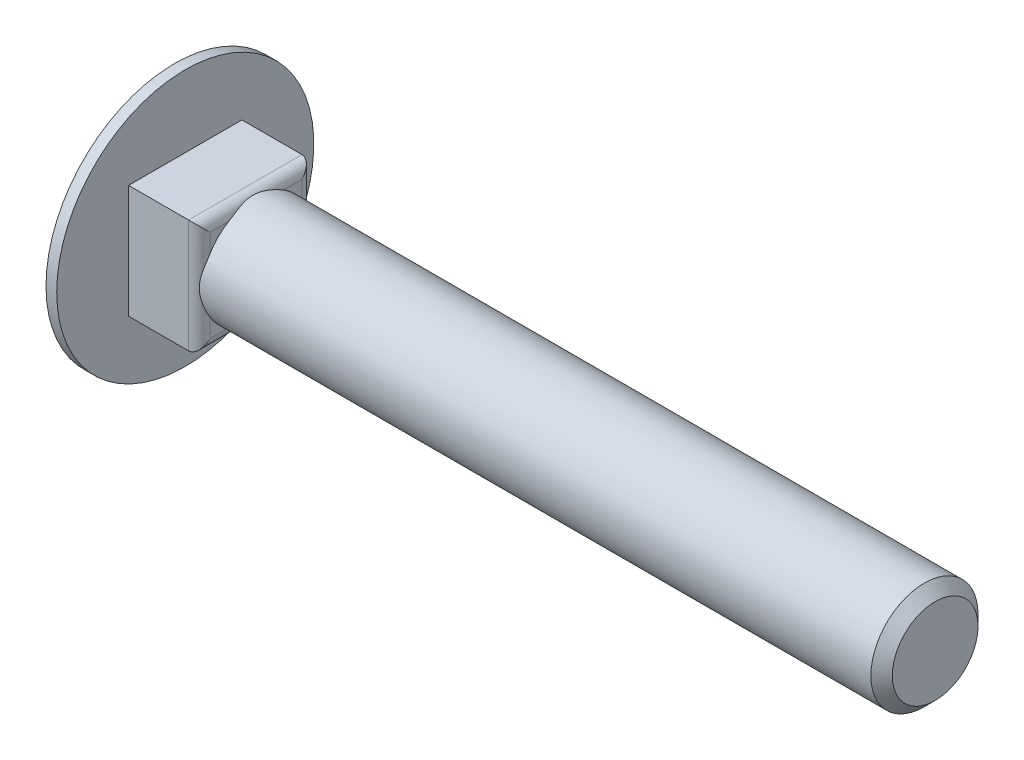
ISO-10303-21;
HEADER;
FILE_DESCRIPTION(('STEP AP214'),'2;1');
FILE_NAME('part.step','',(''),(''),'','','');
FILE_SCHEMA(('AUTOMOTIVE_DESIGN { 1 0 10303 214 1 1 1 1 }'));
ENDSEC;
DATA;
#1=APPLICATION_CONTEXT('core data for automotive mechanical design processes');
#2=APPLICATION_PROTOCOL_DEFINITION('international standard','automotive_design',2000,#1);
#3=PRODUCT_CONTEXT('',#1,'mechanical');
#4=PRODUCT('Part','Part','',(#3));
#5=PRODUCT_RELATED_PRODUCT_CATEGORY('part','',(#4));
#6=PRODUCT_DEFINITION_FORMATION('','',#4);
#7=PRODUCT_DEFINITION_CONTEXT('part definition',#1,'design');
#8=PRODUCT_DEFINITION('design','',#6,#7);
#9=PRODUCT_DEFINITION_SHAPE('','',#8);
#10=(LENGTH_UNIT() NAMED_UNIT(*) SI_UNIT(.MILLI.,.METRE.));
#11=(NAMED_UNIT(*) PLANE_ANGLE_UNIT() SI_UNIT($,.RADIAN.));
#12=(NAMED_UNIT(*) SI_UNIT($,.STERADIAN.) SOLID_ANGLE_UNIT());
#13=UNCERTAINTY_MEASURE_WITH_UNIT(LENGTH_MEASURE(1.E-05),#10,'distance_accuracy_value','');
#14=(GEOMETRIC_REPRESENTATION_CONTEXT(3) GLOBAL_UNCERTAINTY_ASSIGNED_CONTEXT((#13)) GLOBAL_UNIT_ASSIGNED_CONTEXT((#10,
#11,#12)) REPRESENTATION_CONTEXT('',''));
#15=CARTESIAN_POINT('',(0.,0.,0.));
#16=DIRECTION('',(0.,0.,1.));
#17=DIRECTION('',(1.,0.,0.));
#18=AXIS2_PLACEMENT_3D('',#15,#16,#17);
#19=CARTESIAN_POINT('',(37.5014084523517,0.,0.123465529352245));
#20=DIRECTION('',(0.,-1.,0.));
#21=DIRECTION('',(0.,0.,1.));
#22=AXIS2_PLACEMENT_3D('',#19,#20,#21);
#23=CIRCLE('',#22,40.2915688928503);
#24=TRIMMED_CURVE('',#23,(PARAMETER_VALUE(-1.57386063344684)),
(PARAMETER_VALUE(1.57386063344684)),.T.,.PARAMETER.);
#25=CARTESIAN_POINT('',(37.5014084523517,0.,0.));
#26=DIRECTION('',(-1.,0.,0.));
#27=AXIS1_PLACEMENT('',#25,#26);
#28=SURFACE_OF_REVOLUTION('',#24,#27);
#29=CARTESIAN_POINT('',(-1.,0.,0.));
#30=DIRECTION('',(-1.,0.,0.));
#31=DIRECTION('',(0.,0.,1.));
#32=AXIS2_PLACEMENT_3D('',#29,#30,#31);
#33=CIRCLE('',#32,12.);
#34=CARTESIAN_POINT('',(-1.,0.,12.));
#35=VERTEX_POINT('',#34);
#36=EDGE_CURVE('E263',#35,#35,#33,.F.);
#37=ORIENTED_EDGE('',*,*,#36,.F.);
#38=EDGE_LOOP('',(#37));
#39=FACE_BOUND('',#38,.T.);
#40=CARTESIAN_POINT('',(-2.78997127222914,0.,0.));
#41=VERTEX_POINT('',#40);
#42=VERTEX_LOOP('',#41);
#43=FACE_BOUND('',#42,.T.);
#44=ADVANCED_FACE('F16',(#39,#43),#28,.T.);
#45=CARTESIAN_POINT('',(-0.5,0.,0.));
#46=DIRECTION('',(-1.,0.,0.));
#47=DIRECTION('',(0.,0.,1.));
#48=AXIS2_PLACEMENT_3D('',#45,#46,#47);
#49=CYLINDRICAL_SURFACE('',#48,12.);
#50=CARTESIAN_POINT('',(0.,0.,0.));
#51=DIRECTION('',(-1.,0.,0.));
#52=DIRECTION('',(0.,0.,1.));
#53=AXIS2_PLACEMENT_3D('',#50,#51,#52);
#54=CIRCLE('',#53,12.);
#55=CARTESIAN_POINT('',(0.,0.,12.));
#56=VERTEX_POINT('',#55);
#57=EDGE_CURVE('E19',#56,#56,#54,.F.);
#58=ORIENTED_EDGE('',*,*,#57,.F.);
#59=EDGE_LOOP('',(#58));
#60=FACE_BOUND('',#59,.T.);
#61=ORIENTED_EDGE('',*,*,#36,.T.);
#62=EDGE_LOOP('',(#61));
#63=FACE_BOUND('',#62,.T.);
#64=ADVANCED_FACE('F273',(#60,#63),#49,.T.);
#65=CARTESIAN_POINT('',(0.,0.,12.));
#66=DIRECTION('',(1.,0.,0.));
#67=DIRECTION('',(0.,0.,-1.));
#68=AXIS2_PLACEMENT_3D('',#65,#66,#67);
#69=PLANE('',#68);
#70=DIRECTION('',(0.,-1.,0.));
#71=VECTOR('',#70,1.);
#72=CARTESIAN_POINT('',(0.,5.29,5.29));
#73=LINE('',#72,#71);
#74=CARTESIAN_POINT('',(0.,5.29,5.29));
#75=VERTEX_POINT('',#74);
#76=CARTESIAN_POINT('',(0.,-5.29,5.29));
#77=VERTEX_POINT('',#76);
#78=EDGE_CURVE('E97',#75,#77,#73,.T.);
#79=ORIENTED_EDGE('',*,*,#78,.F.);
#80=DIRECTION('',(0.,0.,1.));
#81=VECTOR('',#80,1.);
#82=CARTESIAN_POINT('',(0.,5.29,-5.29));
#83=LINE('',#82,#81);
#84=CARTESIAN_POINT('',(0.,5.29,-5.29));
#85=VERTEX_POINT('',#84);
#86=EDGE_CURVE('E92',#85,#75,#83,.T.);
#87=ORIENTED_EDGE('',*,*,#86,.F.);
#88=DIRECTION('',(0.,1.,0.));
#89=VECTOR('',#88,1.);
#90=CARTESIAN_POINT('',(0.,-5.29,-5.29));
#91=LINE('',#90,#89);
#92=CARTESIAN_POINT('',(0.,-5.29,-5.29));
#93=VERTEX_POINT('',#92);
#94=EDGE_CURVE('E237',#93,#85,#91,.T.);
#95=ORIENTED_EDGE('',*,*,#94,.F.);
#96=DIRECTION('',(0.,0.,-1.));
#97=VECTOR('',#96,1.);
#98=CARTESIAN_POINT('',(0.,-5.29,5.29));
#99=LINE('',#98,#97);
#100=EDGE_CURVE('E238',#77,#93,#99,.T.);
#101=ORIENTED_EDGE('',*,*,#100,.F.);
#102=EDGE_LOOP('',(#79,#87,#95,#101));
#103=FACE_BOUND('',#102,.T.);
#104=ORIENTED_EDGE('',*,*,#57,.T.);
#105=EDGE_LOOP('',(#104));
#106=FACE_BOUND('',#105,.T.);
#107=ADVANCED_FACE('F271',(#103,#106),#69,.T.);
#108=CARTESIAN_POINT('',(0.,5.29,-5.29));
#109=DIRECTION('',(0.,1.,0.));
#110=DIRECTION('',(0.,0.,1.));
#111=AXIS2_PLACEMENT_3D('',#108,#109,#110);
#112=PLANE('',#111);
#113=ORIENTED_EDGE('',*,*,#86,.T.);
#114=DIRECTION('',(1.,0.,0.));
#115=VECTOR('',#114,1.);
#116=CARTESIAN_POINT('',(0.,5.29,5.29));
#117=LINE('',#116,#115);
#118=CARTESIAN_POINT('',(5.6,5.29,5.29));
#119=VERTEX_POINT('',#118);
#120=EDGE_CURVE('E84',#119,#75,#117,.F.);
#121=ORIENTED_EDGE('',*,*,#120,.F.);
#122=DIRECTION('',(0.,0.,1.));
#123=VECTOR('',#122,1.);
#124=CARTESIAN_POINT('',(5.6,5.29,-2.645));
#125=LINE('',#124,#123);
#126=CARTESIAN_POINT('',(5.6,5.29,-5.29));
#127=VERTEX_POINT('',#126);
#128=EDGE_CURVE('E88',#127,#119,#125,.T.);
#129=ORIENTED_EDGE('',*,*,#128,.F.);
#130=DIRECTION('',(1.,0.,0.));
#131=VECTOR('',#130,1.);
#132=CARTESIAN_POINT('',(0.,5.29,-5.29));
#133=LINE('',#132,#131);
#134=EDGE_CURVE('E233',#85,#127,#133,.T.);
#135=ORIENTED_EDGE('',*,*,#134,.F.);
#136=EDGE_LOOP('',(#113,#121,#129,#135));
#137=FACE_BOUND('',#136,.T.);
#138=ADVANCED_FACE('F86',(#137),#112,.T.);
#139=CARTESIAN_POINT('',(0.,5.29,5.29));
#140=DIRECTION('',(0.,0.,1.));
#141=DIRECTION('',(0.,-1.,0.));
#142=AXIS2_PLACEMENT_3D('',#139,#140,#141);
#143=PLANE('',#142);
#144=ORIENTED_EDGE('',*,*,#78,.T.);
#145=DIRECTION('',(1.,0.,0.));
#146=VECTOR('',#145,1.);
#147=CARTESIAN_POINT('',(0.,-5.29,5.29));
#148=LINE('',#147,#146);
#149=CARTESIAN_POINT('',(5.6,-5.29,5.29));
#150=VERTEX_POINT('',#149);
#151=EDGE_CURVE('E116',#150,#77,#148,.F.);
#152=ORIENTED_EDGE('',*,*,#151,.F.);
#153=DIRECTION('',(0.,-1.,0.));
#154=VECTOR('',#153,1.);
#155=CARTESIAN_POINT('',(5.6,2.645,5.29));
#156=LINE('',#155,#154);
#157=EDGE_CURVE('E113',#119,#150,#156,.T.);
#158=ORIENTED_EDGE('',*,*,#157,.F.);
#159=ORIENTED_EDGE('',*,*,#120,.T.);
#160=EDGE_LOOP('',(#144,#152,#158,#159));
#161=FACE_BOUND('',#160,.T.);
#162=ADVANCED_FACE('F114',(#161),#143,.T.);
#163=CARTESIAN_POINT('',(0.,-5.29,5.29));
#164=DIRECTION('',(0.,-1.,0.));
#165=DIRECTION('',(0.,0.,-1.));
#166=AXIS2_PLACEMENT_3D('',#163,#164,#165);
#167=PLANE('',#166);
#168=ORIENTED_EDGE('',*,*,#100,.T.);
#169=DIRECTION('',(1.,0.,0.));
#170=VECTOR('',#169,1.);
#171=CARTESIAN_POINT('',(0.,-5.29,-5.29));
#172=LINE('',#171,#170);
#173=CARTESIAN_POINT('',(5.6,-5.29,-5.29));
#174=VERTEX_POINT('',#173);
#175=EDGE_CURVE('E234',#174,#93,#172,.F.);
#176=ORIENTED_EDGE('',*,*,#175,.F.);
#177=DIRECTION('',(0.,0.,-1.));
#178=VECTOR('',#177,1.);
#179=CARTESIAN_POINT('',(5.6,-5.29,2.645));
#180=LINE('',#179,#178);
#181=EDGE_CURVE('E130',#150,#174,#180,.T.);
#182=ORIENTED_EDGE('',*,*,#181,.F.);
#183=ORIENTED_EDGE('',*,*,#151,.T.);
#184=EDGE_LOOP('',(#168,#176,#182,#183));
#185=FACE_BOUND('',#184,.T.);
#186=ADVANCED_FACE('F288',(#185),#167,.T.);
#187=CARTESIAN_POINT('',(0.,-5.29,-5.29));
#188=DIRECTION('',(0.,0.,-1.));
#189=DIRECTION('',(0.,1.,0.));
#190=AXIS2_PLACEMENT_3D('',#187,#188,#189);
#191=PLANE('',#190);
#192=ORIENTED_EDGE('',*,*,#94,.T.);
#193=ORIENTED_EDGE('',*,*,#134,.T.);
#194=DIRECTION('',(0.,1.,0.));
#195=VECTOR('',#194,1.);
#196=CARTESIAN_POINT('',(5.6,-2.645,-5.29));
#197=LINE('',#196,#195);
#198=EDGE_CURVE('E135',#174,#127,#197,.T.);
#199=ORIENTED_EDGE('',*,*,#198,.F.);
#200=ORIENTED_EDGE('',*,*,#175,.T.);
#201=EDGE_LOOP('',(#192,#193,#199,#200));
#202=FACE_BOUND('',#201,.T.);
#203=ADVANCED_FACE('F291',(#202),#191,.T.);
#204=CARTESIAN_POINT('',(70.,0.,0.));
#205=DIRECTION('',(1.,0.,0.));
#206=DIRECTION('',(0.,0.,-1.));
#207=AXIS2_PLACEMENT_3D('',#204,#205,#206);
#208=PLANE('',#207);
#209=CARTESIAN_POINT('',(70.00000000005,0.,0.));
#210=DIRECTION('',(-1.,0.,0.));
#211=DIRECTION('',(0.,0.,1.));
#212=AXIS2_PLACEMENT_3D('',#209,#210,#211);
#213=CIRCLE('',#212,3.99999999996226);
#214=CARTESIAN_POINT('',(70.00000000005,0.,3.99999999996226));
#215=VERTEX_POINT('',#214);
#216=EDGE_CURVE('E138',#215,#215,#213,.T.);
#217=ORIENTED_EDGE('',*,*,#216,.F.);
#218=EDGE_LOOP('',(#217));
#219=FACE_BOUND('',#218,.T.);
#220=ADVANCED_FACE('F295',(#219),#208,.T.);
#221=CARTESIAN_POINT('',(6.6,0.,0.));
#222=DIRECTION('',(1.,0.,0.));
#223=DIRECTION('',(0.,0.,-1.));
#224=AXIS2_PLACEMENT_3D('',#221,#222,#223);
#225=PLANE('',#224);
#226=CARTESIAN_POINT('',(6.6,0.,0.));
#227=DIRECTION('',(1.,0.,0.));
#228=DIRECTION('',(0.,0.,-1.));
#229=AXIS2_PLACEMENT_3D('',#226,#227,#228);
#230=CIRCLE('',#229,5.);
#231=CARTESIAN_POINT('',(6.6,2.56824843035093,-4.29));
#232=VERTEX_POINT('',#231);
#233=CARTESIAN_POINT('',(6.6,4.29,-2.56824843035092));
#234=VERTEX_POINT('',#233);
#235=EDGE_CURVE('E141',#232,#234,#230,.T.);
#236=ORIENTED_EDGE('',*,*,#235,.F.);
#237=DIRECTION('',(0.,1.,0.));
#238=VECTOR('',#237,1.);
#239=CARTESIAN_POINT('',(6.6,-2.645,-4.29));
#240=LINE('',#239,#238);
#241=CARTESIAN_POINT('',(6.6,4.29,-4.29));
#242=VERTEX_POINT('',#241);
#243=EDGE_CURVE('E137',#242,#232,#240,.F.);
#244=ORIENTED_EDGE('',*,*,#243,.F.);
#245=DIRECTION('',(0.,0.,1.));
#246=VECTOR('',#245,1.);
#247=CARTESIAN_POINT('',(6.6,4.29,-2.645));
#248=LINE('',#247,#246);
#249=EDGE_CURVE('E110',#234,#242,#248,.F.);
#250=ORIENTED_EDGE('',*,*,#249,.F.);
#251=EDGE_LOOP('',(#236,#244,#250));
#252=FACE_BOUND('',#251,.T.);
#253=ADVANCED_FACE('F298',(#252),#225,.T.);
#254=CARTESIAN_POINT('',(5.6,4.29,-2.645));
#255=DIRECTION('',(0.,0.,1.));
#256=DIRECTION('',(0.,-1.,0.));
#257=AXIS2_PLACEMENT_3D('',#254,#255,#256);
#258=CYLINDRICAL_SURFACE('',#257,1.);
#259=CARTESIAN_POINT('',(5.6,4.29,4.29));
#260=DIRECTION('',(0.,-0.707106781186548,0.707106781186547));
#261=DIRECTION('',(0.,-0.707106781186547,-0.707106781186548));
#262=AXIS2_PLACEMENT_3D('',#259,#260,#261);
#263=ELLIPSE('',#262,1.4142135623731,1.);
#264=CARTESIAN_POINT('',(6.6,4.29,4.29));
#265=VERTEX_POINT('',#264);
#266=EDGE_CURVE('E104',#265,#119,#263,.T.);
#267=ORIENTED_EDGE('',*,*,#266,.F.);
#268=DIRECTION('',(0.,0.,-1.));
#269=VECTOR('',#268,1.);
#270=CARTESIAN_POINT('',(6.6,4.29,0.));
#271=LINE('',#270,#269);
#272=CARTESIAN_POINT('',(6.6,4.29,2.56824843035093));
#273=VERTEX_POINT('',#272);
#274=EDGE_CURVE('E109',#273,#265,#271,.F.);
#275=ORIENTED_EDGE('',*,*,#274,.F.);
#276=CARTESIAN_POINT('',(6.6,4.29,-2.56824843035092));
#277=CARTESIAN_POINT('',(6.59999368223354,4.31854459490439,-2.52056975857219));
#278=CARTESIAN_POINT('',(6.59877869399954,4.34628182928104,-2.47243161373813));
#279=CARTESIAN_POINT('',(6.59428964859662,4.40008697630088,-2.37535475945281));
#280=CARTESIAN_POINT('',(6.59101662828579,4.42615572226357,-2.32641646521068));
#281=CARTESIAN_POINT('',(6.57866636501416,4.50169037205862,-2.17875806906298));
#282=CARTESIAN_POINT('',(6.56705421291249,4.54863093359771,-2.07894986130947));
#283=CARTESIAN_POINT('',(6.53933971495493,4.63606930003513,-1.87595635198198));
#284=CARTESIAN_POINT('',(6.52319175963584,4.67649473071835,-1.77274667276831));
#285=CARTESIAN_POINT('',(6.48867655871684,4.75034244567476,-1.56412924028271));
#286=CARTESIAN_POINT('',(6.47030746123656,4.78375882177883,-1.45871971431179));
#287=CARTESIAN_POINT('',(6.43078998213867,4.84804673370732,-1.22988586495137));
#288=CARTESIAN_POINT('',(6.40963971816789,4.87777684596299,-1.10613953882674));
#289=CARTESIAN_POINT('',(6.3708598536595,4.92779285907507,-0.856206700548002));
#290=CARTESIAN_POINT('',(6.35322945129354,4.94808091224789,-0.730020751343143));
#291=CARTESIAN_POINT('',(6.32521223148538,4.9788452290722,-0.476685017296593));
#292=CARTESIAN_POINT('',(6.31476590108465,4.98940235869364,-0.349552192804016));
#293=CARTESIAN_POINT('',(6.30351143433455,5.00073571586425,-0.0944537416410191));
#294=CARTESIAN_POINT('',(6.30269815032818,5.00151716730178,0.0335114036739653));
#295=CARTESIAN_POINT('',(6.31093128411986,4.99328027189852,0.289016493618458));
#296=CARTESIAN_POINT('',(6.3199961867549,4.98424355262156,0.416555191574631));
#297=CARTESIAN_POINT('',(6.34567629752511,4.95656655476155,0.669858379590138));
#298=CARTESIAN_POINT('',(6.3622977334172,4.93791835312605,0.795621317824817));
#299=CARTESIAN_POINT('',(6.39972973203653,4.89110934099442,1.04563247402555));
#300=CARTESIAN_POINT('',(6.42056931111953,4.86288167031048,1.16986350461113));
#301=CARTESIAN_POINT('',(6.46278336336014,4.79708303871945,1.41568901364678));
#302=CARTESIAN_POINT('',(6.48415763158187,4.75951560966866,1.53728446989295));
#303=CARTESIAN_POINT('',(6.51722329280124,4.68955428587987,1.73639749358073));
#304=CARTESIAN_POINT('',(6.52972003284679,4.65981067365376,1.81471857575788));
#305=CARTESIAN_POINT('',(6.55252747640571,4.59631381079154,1.97000856491698));
#306=CARTESIAN_POINT('',(6.56283924712876,4.56256253025881,2.04697811510379));
#307=CARTESIAN_POINT('',(6.58022354763676,4.49125913392421,2.19899805000209));
#308=CARTESIAN_POINT('',(6.58731403212837,4.4537295463927,2.27405681494473));
#309=CARTESIAN_POINT('',(6.59718880987703,4.37476277114856,2.42250825571608));
#310=CARTESIAN_POINT('',(6.59996688487579,4.33332003199457,2.49589837558603));
#311=CARTESIAN_POINT('',(6.6,4.29,2.56824843035092));
#312=B_SPLINE_CURVE_WITH_KNOTS('',3,(#276,#277,#278,#279,#280,#281,#282,#283,#284,#285,#286,
#287,#288,#289,#290,#291,#292,#293,#294,#295,#296,#297,#298,#299,#300,#301,#302,#303,#304,#305,
#306,#307,#308,#309,#310,#311),.UNSPECIFIED.,.F.,.F.,(4,2,2,2,2,2,2,2,2,2,2,2,2,2,2,2,2,4),(0.,
0.166657590119382,0.333231283602844,0.665527108088137,1.00129190467929,1.33733860133852,
1.7240012635808,2.11057574288578,2.49390795718709,2.87703531917573,3.2608808521722,
3.64504330859431,4.03194414965618,4.4186989050097,4.67270229405509,4.92658133218418,
5.1790274030789,5.4318371503571),.UNSPECIFIED.);
#313=EDGE_CURVE('E144',#234,#273,#312,.T.);
#314=ORIENTED_EDGE('',*,*,#313,.F.);
#315=ORIENTED_EDGE('',*,*,#249,.T.);
#316=CARTESIAN_POINT('',(5.6,4.29,-4.29));
#317=DIRECTION('',(0.,0.707106781186547,0.707106781186548));
#318=DIRECTION('',(0.,0.707106781186548,-0.707106781186547));
#319=AXIS2_PLACEMENT_3D('',#316,#317,#318);
#320=ELLIPSE('',#319,1.41421356237309,1.);
#321=EDGE_CURVE('E107',#127,#242,#320,.F.);
#322=ORIENTED_EDGE('',*,*,#321,.F.);
#323=ORIENTED_EDGE('',*,*,#128,.T.);
#324=EDGE_LOOP('',(#267,#275,#314,#315,#322,#323));
#325=FACE_BOUND('',#324,.T.);
#326=ADVANCED_FACE('F102',(#325),#258,.T.);
#327=CARTESIAN_POINT('',(6.6,0.,0.));
#328=DIRECTION('',(1.,0.,0.));
#329=DIRECTION('',(0.,0.,-1.));
#330=AXIS2_PLACEMENT_3D('',#327,#328,#329);
#331=PLANE('',#330);
#332=DIRECTION('',(0.,-1.,0.));
#333=VECTOR('',#332,1.);
#334=CARTESIAN_POINT('',(6.6,2.645,4.29));
#335=LINE('',#334,#333);
#336=CARTESIAN_POINT('',(6.6,2.56824843035093,4.29));
#337=VERTEX_POINT('',#336);
#338=EDGE_CURVE('E124',#337,#265,#335,.F.);
#339=ORIENTED_EDGE('',*,*,#338,.F.);
#340=CARTESIAN_POINT('',(6.6,0.,0.));
#341=DIRECTION('',(1.,0.,0.));
#342=DIRECTION('',(0.,0.,-1.));
#343=AXIS2_PLACEMENT_3D('',#340,#341,#342);
#344=CIRCLE('',#343,5.);
#345=EDGE_CURVE('E152',#273,#337,#344,.T.);
#346=ORIENTED_EDGE('',*,*,#345,.F.);
#347=ORIENTED_EDGE('',*,*,#274,.T.);
#348=EDGE_LOOP('',(#339,#346,#347));
#349=FACE_BOUND('',#348,.T.);
#350=ADVANCED_FACE('F196',(#349),#331,.T.);
#351=CARTESIAN_POINT('',(5.6,2.645,4.29));
#352=DIRECTION('',(0.,-1.,0.));
#353=DIRECTION('',(0.,0.,-1.));
#354=AXIS2_PLACEMENT_3D('',#351,#352,#353);
#355=CYLINDRICAL_SURFACE('',#354,1.);
#356=CARTESIAN_POINT('',(5.6,-4.29,4.29));
#357=DIRECTION('',(0.,-0.707106781186547,-0.707106781186548));
#358=DIRECTION('',(0.,0.707106781186548,-0.707106781186547));
#359=AXIS2_PLACEMENT_3D('',#356,#357,#358);
#360=ELLIPSE('',#359,1.41421356237309,1.);
#361=CARTESIAN_POINT('',(6.6,-4.29,4.29));
#362=VERTEX_POINT('',#361);
#363=EDGE_CURVE('E127',#362,#150,#360,.T.);
#364=ORIENTED_EDGE('',*,*,#363,.F.);
#365=DIRECTION('',(0.,1.,0.));
#366=VECTOR('',#365,1.);
#367=CARTESIAN_POINT('',(6.6,0.,4.29));
#368=LINE('',#367,#366);
#369=CARTESIAN_POINT('',(6.6,-2.56824843035093,4.29));
#370=VERTEX_POINT('',#369);
#371=EDGE_CURVE('E120',#370,#362,#368,.F.);
#372=ORIENTED_EDGE('',*,*,#371,.F.);
#373=CARTESIAN_POINT('',(6.6,2.56824843035093,4.29));
#374=CARTESIAN_POINT('',(6.59999368223354,2.5205697585722,4.31854459490439));
#375=CARTESIAN_POINT('',(6.59877869399954,2.47243161373813,4.34628182928103));
#376=CARTESIAN_POINT('',(6.59428964859662,2.37535475945282,4.40008697630088));
#377=CARTESIAN_POINT('',(6.59101662828579,2.32641646521069,4.42615572226357));
#378=CARTESIAN_POINT('',(6.57866636501416,2.17875806906299,4.50169037205861));
#379=CARTESIAN_POINT('',(6.56705421291249,2.07894986130948,4.5486309335977));
#380=CARTESIAN_POINT('',(6.53933971495493,1.87595635198199,4.63606930003512));
#381=CARTESIAN_POINT('',(6.52319175963584,1.77274667276832,4.67649473071835));
#382=CARTESIAN_POINT('',(6.48867655871684,1.56412924028273,4.75034244567475));
#383=CARTESIAN_POINT('',(6.47030746123656,1.45871971431181,4.78375882177883));
#384=CARTESIAN_POINT('',(6.43078998213867,1.22988586495138,4.84804673370731));
#385=CARTESIAN_POINT('',(6.40963971816789,1.10613953882675,4.87777684596299));
#386=CARTESIAN_POINT('',(6.3708598536595,0.856206700548009,4.92779285907507));
#387=CARTESIAN_POINT('',(6.35322945129354,0.730020751343148,4.94808091224789));
#388=CARTESIAN_POINT('',(6.32521223148538,0.476685017296594,4.9788452290722));
#389=CARTESIAN_POINT('',(6.31476590108465,0.349552192804015,4.98940235869364));
#390=CARTESIAN_POINT('',(6.30351143433454,0.0944537416410142,5.00073571586425));
#391=CARTESIAN_POINT('',(6.30269815032818,-0.0335114036739721,5.00151716730178));
#392=CARTESIAN_POINT('',(6.31093128411986,-0.289016493618469,4.99328027189852));
#393=CARTESIAN_POINT('',(6.3199961867549,-0.416555191574644,4.98424355262156));
#394=CARTESIAN_POINT('',(6.34567629752511,-0.669858379590155,4.95656655476155));
#395=CARTESIAN_POINT('',(6.3622977334172,-0.795621317824835,4.93791835312605));
#396=CARTESIAN_POINT('',(6.39972973203653,-1.04563247402557,4.89110934099442));
#397=CARTESIAN_POINT('',(6.42056931111953,-1.16986350461116,4.86288167031048));
#398=CARTESIAN_POINT('',(6.46278336336015,-1.41568901364681,4.79708303871944));
#399=CARTESIAN_POINT('',(6.48415763158187,-1.53728446989298,4.75951560966865));
#400=CARTESIAN_POINT('',(6.51722329280125,-1.73639749358076,4.68955428587986));
#401=CARTESIAN_POINT('',(6.52972003284679,-1.8147185757579,4.65981067365375));
#402=CARTESIAN_POINT('',(6.55252747640572,-1.970008564917,4.59631381079153));
#403=CARTESIAN_POINT('',(6.56283924712877,-2.04697811510381,4.5625625302588));
#404=CARTESIAN_POINT('',(6.58022354763676,-2.19899805000211,4.4912591339242));
#405=CARTESIAN_POINT('',(6.58731403212837,-2.27405681494475,4.4537295463927));
#406=CARTESIAN_POINT('',(6.59718880987703,-2.42250825571609,4.37476277114855));
#407=CARTESIAN_POINT('',(6.59996688487579,-2.49589837558604,4.33332003199457));
#408=CARTESIAN_POINT('',(6.6,-2.56824843035093,4.29));
#409=B_SPLINE_CURVE_WITH_KNOTS('',3,(#373,#374,#375,#376,#377,#378,#379,#380,#381,#382,#383,
#384,#385,#386,#387,#388,#389,#390,#391,#392,#393,#394,#395,#396,#397,#398,#399,#400,#401,#402,
#403,#404,#405,#406,#407,#408),.UNSPECIFIED.,.F.,.F.,(4,2,2,2,2,2,2,2,2,2,2,2,2,2,2,2,2,4),(0.,
0.16665759011938,0.333231283602842,0.665527108088133,1.00129190467928,1.33733860133851,
1.7240012635808,2.11057574288579,2.4939079571871,2.87703531917575,3.26088085217223,
3.64504330859434,4.03194414965622,4.41869890500974,4.67270229405513,4.92658133218421,
5.17902740307892,5.43183715035712),.UNSPECIFIED.);
#410=EDGE_CURVE('E197',#337,#370,#409,.T.);
#411=ORIENTED_EDGE('',*,*,#410,.F.);
#412=ORIENTED_EDGE('',*,*,#338,.T.);
#413=ORIENTED_EDGE('',*,*,#266,.T.);
#414=ORIENTED_EDGE('',*,*,#157,.T.);
#415=EDGE_LOOP('',(#364,#372,#411,#412,#413,#414));
#416=FACE_BOUND('',#415,.T.);
#417=ADVANCED_FACE('F122',(#416),#355,.T.);
#418=CARTESIAN_POINT('',(6.6,0.,0.));
#419=DIRECTION('',(1.,0.,0.));
#420=DIRECTION('',(0.,0.,-1.));
#421=AXIS2_PLACEMENT_3D('',#418,#419,#420);
#422=PLANE('',#421);
#423=DIRECTION('',(0.,0.,-1.));
#424=VECTOR('',#423,1.);
#425=CARTESIAN_POINT('',(6.6,-4.29,2.645));
#426=LINE('',#425,#424);
#427=CARTESIAN_POINT('',(6.6,-4.29,2.56824843035093));
#428=VERTEX_POINT('',#427);
#429=EDGE_CURVE('E131',#428,#362,#426,.F.);
#430=ORIENTED_EDGE('',*,*,#429,.F.);
#431=CARTESIAN_POINT('',(6.6,0.,0.));
#432=DIRECTION('',(1.,0.,0.));
#433=DIRECTION('',(0.,0.,-1.));
#434=AXIS2_PLACEMENT_3D('',#431,#432,#433);
#435=CIRCLE('',#434,5.);
#436=EDGE_CURVE('E182',#370,#428,#435,.T.);
#437=ORIENTED_EDGE('',*,*,#436,.F.);
#438=ORIENTED_EDGE('',*,*,#371,.T.);
#439=EDGE_LOOP('',(#430,#437,#438));
#440=FACE_BOUND('',#439,.T.);
#441=ADVANCED_FACE('F189',(#440),#422,.T.);
#442=CARTESIAN_POINT('',(5.6,-4.29,2.645));
#443=DIRECTION('',(0.,0.,-1.));
#444=DIRECTION('',(-1.,0.,0.));
#445=AXIS2_PLACEMENT_3D('',#442,#443,#444);
#446=CYLINDRICAL_SURFACE('',#445,1.);
#447=CARTESIAN_POINT('',(5.6,-4.29,-4.29));
#448=DIRECTION('',(0.,0.707106781186548,-0.707106781186547));
#449=DIRECTION('',(0.,0.707106781186547,0.707106781186548));
#450=AXIS2_PLACEMENT_3D('',#447,#448,#449);
#451=ELLIPSE('',#450,1.4142135623731,1.);
#452=CARTESIAN_POINT('',(6.6,-4.29,-4.29));
#453=VERTEX_POINT('',#452);
#454=EDGE_CURVE('E132',#453,#174,#451,.T.);
#455=ORIENTED_EDGE('',*,*,#454,.F.);
#456=DIRECTION('',(0.,0.,-1.));
#457=VECTOR('',#456,1.);
#458=CARTESIAN_POINT('',(6.6,-4.29,0.));
#459=LINE('',#458,#457);
#460=CARTESIAN_POINT('',(6.6,-4.29,-2.56824843035093));
#461=VERTEX_POINT('',#460);
#462=EDGE_CURVE('E215',#461,#453,#459,.T.);
#463=ORIENTED_EDGE('',*,*,#462,.F.);
#464=CARTESIAN_POINT('',(6.6,-4.29,2.56824843035093));
#465=CARTESIAN_POINT('',(6.59999368223354,-4.31854459490439,2.5205697585722));
#466=CARTESIAN_POINT('',(6.59877869399954,-4.34628182928103,2.47243161373813));
#467=CARTESIAN_POINT('',(6.59428964859662,-4.40008697630087,2.37535475945282));
#468=CARTESIAN_POINT('',(6.59101662828579,-4.42615572226357,2.32641646521069));
#469=CARTESIAN_POINT('',(6.57866636501416,-4.50169037205861,2.17875806906299));
#470=CARTESIAN_POINT('',(6.56705421291249,-4.5486309335977,2.07894986130948));
#471=CARTESIAN_POINT('',(6.53933971495493,-4.63606930003512,1.87595635198199));
#472=CARTESIAN_POINT('',(6.52319175963584,-4.67649473071835,1.77274667276832));
#473=CARTESIAN_POINT('',(6.48867655871684,-4.75034244567475,1.56412924028273));
#474=CARTESIAN_POINT('',(6.47030746123656,-4.78375882177882,1.45871971431181));
#475=CARTESIAN_POINT('',(6.43078998213867,-4.84804673370731,1.22988586495138));
#476=CARTESIAN_POINT('',(6.40963971816789,-4.87777684596299,1.10613953882675));
#477=CARTESIAN_POINT('',(6.3708598536595,-4.92779285907507,0.85620670054801));
#478=CARTESIAN_POINT('',(6.35322945129354,-4.94808091224789,0.730020751343148));
#479=CARTESIAN_POINT('',(6.32521223148538,-4.9788452290722,0.476685017296595));
#480=CARTESIAN_POINT('',(6.31476590108465,-4.98940235869364,0.349552192804016));
#481=CARTESIAN_POINT('',(6.30351143433455,-5.00073571586425,0.0944537416410152));
#482=CARTESIAN_POINT('',(6.30269815032818,-5.00151716730178,-0.033511403673971));
#483=CARTESIAN_POINT('',(6.31093128411986,-4.99328027189852,-0.289016493618468));
#484=CARTESIAN_POINT('',(6.3199961867549,-4.98424355262156,-0.416555191574643));
#485=CARTESIAN_POINT('',(6.34567629752511,-4.95656655476155,-0.669858379590153));
#486=CARTESIAN_POINT('',(6.3622977334172,-4.93791835312605,-0.795621317824833));
#487=CARTESIAN_POINT('',(6.39972973203653,-4.89110934099442,-1.04563247402557));
#488=CARTESIAN_POINT('',(6.42056931111953,-4.86288167031048,-1.16986350461115));
#489=CARTESIAN_POINT('',(6.46278336336015,-4.79708303871944,-1.4156890136468));
#490=CARTESIAN_POINT('',(6.48415763158187,-4.75951560966865,-1.53728446989298));
#491=CARTESIAN_POINT('',(6.51722329280125,-4.68955428587986,-1.73639749358076));
#492=CARTESIAN_POINT('',(6.52972003284679,-4.65981067365375,-1.8147185757579));
#493=CARTESIAN_POINT('',(6.55252747640572,-4.59631381079153,-1.970008564917));
#494=CARTESIAN_POINT('',(6.56283924712877,-4.5625625302588,-2.04697811510381));
#495=CARTESIAN_POINT('',(6.58022354763676,-4.4912591339242,-2.19899805000211));
#496=CARTESIAN_POINT('',(6.58731403212837,-4.4537295463927,-2.27405681494475));
#497=CARTESIAN_POINT('',(6.59718880987703,-4.37476277114855,-2.42250825571609));
#498=CARTESIAN_POINT('',(6.59996688487579,-4.33332003199457,-2.49589837558604));
#499=CARTESIAN_POINT('',(6.6,-4.29,-2.56824843035093));
#500=B_SPLINE_CURVE_WITH_KNOTS('',3,(#464,#465,#466,#467,#468,#469,#470,#471,#472,#473,#474,
#475,#476,#477,#478,#479,#480,#481,#482,#483,#484,#485,#486,#487,#488,#489,#490,#491,#492,#493,
#494,#495,#496,#497,#498,#499),.UNSPECIFIED.,.F.,.F.,(4,2,2,2,2,2,2,2,2,2,2,2,2,2,2,2,2,4),(0.,
0.166657590119381,0.333231283602843,0.665527108088134,1.00129190467928,1.33733860133851,
1.7240012635808,2.11057574288579,2.4939079571871,2.87703531917575,3.26088085217223,
3.64504330859434,4.03194414965622,4.41869890500974,4.67270229405513,4.92658133218421,
5.17902740307893,5.43183715035712),.UNSPECIFIED.);
#501=EDGE_CURVE('E174',#428,#461,#500,.T.);
#502=ORIENTED_EDGE('',*,*,#501,.F.);
#503=ORIENTED_EDGE('',*,*,#429,.T.);
#504=ORIENTED_EDGE('',*,*,#363,.T.);
#505=ORIENTED_EDGE('',*,*,#181,.T.);
#506=EDGE_LOOP('',(#455,#463,#502,#503,#504,#505));
#507=FACE_BOUND('',#506,.T.);
#508=ADVANCED_FACE('F183',(#507),#446,.T.);
#509=CARTESIAN_POINT('',(6.6,0.,0.));
#510=DIRECTION('',(1.,0.,0.));
#511=DIRECTION('',(0.,0.,-1.));
#512=AXIS2_PLACEMENT_3D('',#509,#510,#511);
#513=PLANE('',#512);
#514=CARTESIAN_POINT('',(6.6,0.,0.));
#515=DIRECTION('',(1.,0.,0.));
#516=DIRECTION('',(0.,0.,-1.));
#517=AXIS2_PLACEMENT_3D('',#514,#515,#516);
#518=CIRCLE('',#517,5.);
#519=CARTESIAN_POINT('',(6.6,-2.56824843035092,-4.29));
#520=VERTEX_POINT('',#519);
#521=EDGE_CURVE('E181',#461,#520,#518,.T.);
#522=ORIENTED_EDGE('',*,*,#521,.F.);
#523=ORIENTED_EDGE('',*,*,#462,.T.);
#524=DIRECTION('',(0.,1.,0.));
#525=VECTOR('',#524,1.);
#526=CARTESIAN_POINT('',(6.6,-2.645,-4.29));
#527=LINE('',#526,#525);
#528=EDGE_CURVE('E34',#520,#453,#527,.F.);
#529=ORIENTED_EDGE('',*,*,#528,.F.);
#530=EDGE_LOOP('',(#522,#523,#529));
#531=FACE_BOUND('',#530,.T.);
#532=ADVANCED_FACE('F188',(#531),#513,.T.);
#533=CARTESIAN_POINT('',(5.6,-2.645,-4.29));
#534=DIRECTION('',(0.,1.,0.));
#535=DIRECTION('',(0.,0.,1.));
#536=AXIS2_PLACEMENT_3D('',#533,#534,#535);
#537=CYLINDRICAL_SURFACE('',#536,1.);
#538=ORIENTED_EDGE('',*,*,#321,.T.);
#539=ORIENTED_EDGE('',*,*,#243,.T.);
#540=CARTESIAN_POINT('',(6.6,-2.56824843035092,-4.29));
#541=CARTESIAN_POINT('',(6.59999368223354,-2.52056975857219,-4.31854459490439));
#542=CARTESIAN_POINT('',(6.59877869399954,-2.47243161373813,-4.34628182928104));
#543=CARTESIAN_POINT('',(6.59428964859662,-2.37535475945281,-4.40008697630088));
#544=CARTESIAN_POINT('',(6.59101662828579,-2.32641646521068,-4.42615572226357));
#545=CARTESIAN_POINT('',(6.57866636501416,-2.17875806906298,-4.50169037205862));
#546=CARTESIAN_POINT('',(6.56705421291249,-2.07894986130947,-4.54863093359771));
#547=CARTESIAN_POINT('',(6.53933971495493,-1.87595635198198,-4.63606930003513));
#548=CARTESIAN_POINT('',(6.52319175963584,-1.77274667276831,-4.67649473071835));
#549=CARTESIAN_POINT('',(6.48867655871684,-1.56412924028271,-4.75034244567476));
#550=CARTESIAN_POINT('',(6.47030746123656,-1.45871971431179,-4.78375882177883));
#551=CARTESIAN_POINT('',(6.43078998213867,-1.22988586495137,-4.84804673370732));
#552=CARTESIAN_POINT('',(6.40963971816789,-1.10613953882674,-4.87777684596299));
#553=CARTESIAN_POINT('',(6.3708598536595,-0.856206700548002,-4.92779285907508));
#554=CARTESIAN_POINT('',(6.35322945129354,-0.730020751343142,-4.94808091224789));
#555=CARTESIAN_POINT('',(6.32521223148538,-0.476685017296592,-4.9788452290722));
#556=CARTESIAN_POINT('',(6.31476590108465,-0.349552192804014,-4.98940235869364));
#557=CARTESIAN_POINT('',(6.30351143433454,-0.0944537416410172,-5.00073571586425));
#558=CARTESIAN_POINT('',(6.30269815032818,0.0335114036739674,-5.00151716730178));
#559=CARTESIAN_POINT('',(6.31093128411986,0.289016493618461,-4.99328027189852));
#560=CARTESIAN_POINT('',(6.3199961867549,0.416555191574634,-4.98424355262156));
#561=CARTESIAN_POINT('',(6.34567629752511,0.66985837959014,-4.95656655476155));
#562=CARTESIAN_POINT('',(6.3622977334172,0.79562131782482,-4.93791835312605));
#563=CARTESIAN_POINT('',(6.39972973203653,1.04563247402555,-4.89110934099442));
#564=CARTESIAN_POINT('',(6.42056931111953,1.16986350461114,-4.86288167031048));
#565=CARTESIAN_POINT('',(6.46278336336014,1.41568901364678,-4.79708303871945));
#566=CARTESIAN_POINT('',(6.48415763158187,1.53728446989295,-4.75951560966866));
#567=CARTESIAN_POINT('',(6.51722329280124,1.73639749358073,-4.68955428587987));
#568=CARTESIAN_POINT('',(6.52972003284679,1.81471857575788,-4.65981067365376));
#569=CARTESIAN_POINT('',(6.55252747640571,1.97000856491698,-4.59631381079154));
#570=CARTESIAN_POINT('',(6.56283924712876,2.04697811510379,-4.56256253025881));
#571=CARTESIAN_POINT('',(6.58022354763676,2.19899805000209,-4.49125913392421));
#572=CARTESIAN_POINT('',(6.58731403212837,2.27405681494473,-4.4537295463927));
#573=CARTESIAN_POINT('',(6.59718880987703,2.42250825571608,-4.37476277114856));
#574=CARTESIAN_POINT('',(6.59996688487579,2.49589837558603,-4.33332003199457));
#575=CARTESIAN_POINT('',(6.6,2.56824843035092,-4.29));
#576=B_SPLINE_CURVE_WITH_KNOTS('',3,(#540,#541,#542,#543,#544,#545,#546,#547,#548,#549,#550,
#551,#552,#553,#554,#555,#556,#557,#558,#559,#560,#561,#562,#563,#564,#565,#566,#567,#568,#569,
#570,#571,#572,#573,#574,#575),.UNSPECIFIED.,.F.,.F.,(4,2,2,2,2,2,2,2,2,2,2,2,2,2,2,2,2,4),(0.,
0.166657590119382,0.333231283602844,0.665527108088137,1.00129190467929,1.33733860133852,
1.7240012635808,2.11057574288578,2.49390795718709,2.87703531917573,3.26088085217221,
3.64504330859431,4.03194414965619,4.41869890500971,4.6727022940551,4.92658133218418,
5.1790274030789,5.4318371503571),.UNSPECIFIED.);
#577=EDGE_CURVE('E25',#520,#232,#576,.T.);
#578=ORIENTED_EDGE('',*,*,#577,.F.);
#579=ORIENTED_EDGE('',*,*,#528,.T.);
#580=ORIENTED_EDGE('',*,*,#454,.T.);
#581=ORIENTED_EDGE('',*,*,#198,.T.);
#582=EDGE_LOOP('',(#538,#539,#578,#579,#580,#581));
#583=FACE_BOUND('',#582,.T.);
#584=ADVANCED_FACE('F220',(#583),#537,.T.);
#585=CARTESIAN_POINT('',(69.0000000001305,0.,0.));
#586=DIRECTION('',(-1.,0.,0.));
#587=DIRECTION('',(0.,0.,1.));
#588=AXIS2_PLACEMENT_3D('',#585,#586,#587);
#589=CONICAL_SURFACE('',#588,4.99999999993861,0.78539816342587);
#590=ORIENTED_EDGE('',*,*,#216,.T.);
#591=EDGE_LOOP('',(#590));
#592=FACE_BOUND('',#591,.T.);
#593=CARTESIAN_POINT('',(69.,0.,0.));
#594=DIRECTION('',(1.,0.,0.));
#595=DIRECTION('',(0.,0.,-1.));
#596=AXIS2_PLACEMENT_3D('',#593,#594,#595);
#597=CIRCLE('',#596,5.);
#598=CARTESIAN_POINT('',(69.,0.,-5.));
#599=VERTEX_POINT('',#598);
#600=EDGE_CURVE('E11',#599,#599,#597,.F.);
#601=ORIENTED_EDGE('',*,*,#600,.F.);
#602=EDGE_LOOP('',(#601));
#603=FACE_BOUND('',#602,.T.);
#604=ADVANCED_FACE('F161',(#592,#603),#589,.T.);
#605=CARTESIAN_POINT('',(6.6,0.,0.));
#606=DIRECTION('',(1.,0.,0.));
#607=DIRECTION('',(0.,0.,-1.));
#608=AXIS2_PLACEMENT_3D('',#605,#606,#607);
#609=CYLINDRICAL_SURFACE('',#608,5.);
#610=ORIENTED_EDGE('',*,*,#600,.T.);
#611=EDGE_LOOP('',(#610));
#612=FACE_BOUND('',#611,.T.);
#613=ORIENTED_EDGE('',*,*,#521,.T.);
#614=ORIENTED_EDGE('',*,*,#577,.T.);
#615=ORIENTED_EDGE('',*,*,#235,.T.);
#616=ORIENTED_EDGE('',*,*,#313,.T.);
#617=ORIENTED_EDGE('',*,*,#345,.T.);
#618=ORIENTED_EDGE('',*,*,#410,.T.);
#619=ORIENTED_EDGE('',*,*,#436,.T.);
#620=ORIENTED_EDGE('',*,*,#501,.T.);
#621=EDGE_LOOP('',(#613,#614,#615,#616,#617,#618,#619,#620));
#622=FACE_BOUND('',#621,.T.);
#623=ADVANCED_FACE('F157',(#612,#622),#609,.T.);
#624=CLOSED_SHELL('',(#44,#64,#107,#138,#162,#186,#203,#220,#253,#326,#350,#417,#441,#508,#532,
#584,#604,#623));
#625=MANIFOLD_SOLID_BREP('B1',#624);
#626=ADVANCED_BREP_SHAPE_REPRESENTATION('',(#18,#625),#14);
#627=SHAPE_DEFINITION_REPRESENTATION(#9,#626);
ENDSEC;
END-ISO-10303-21;
